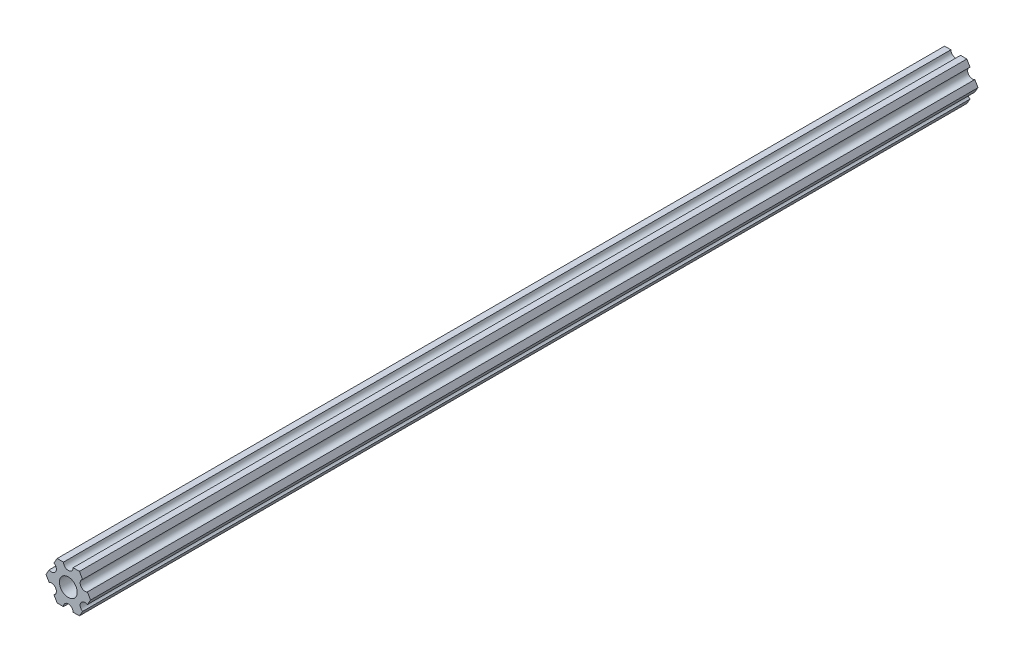
ISO-10303-21;
HEADER;
FILE_DESCRIPTION(('STEP AP214'),'2;1');
FILE_NAME('part.step','',(''),(''),'','','');
FILE_SCHEMA(('AUTOMOTIVE_DESIGN { 1 0 10303 214 1 1 1 1 }'));
ENDSEC;
DATA;
#1=APPLICATION_CONTEXT('core data for automotive mechanical design processes');
#2=APPLICATION_PROTOCOL_DEFINITION('international standard','automotive_design',2000,#1);
#3=PRODUCT_CONTEXT('',#1,'mechanical');
#4=PRODUCT('Part','Part','',(#3));
#5=PRODUCT_RELATED_PRODUCT_CATEGORY('part','',(#4));
#6=PRODUCT_DEFINITION_FORMATION('','',#4);
#7=PRODUCT_DEFINITION_CONTEXT('part definition',#1,'design');
#8=PRODUCT_DEFINITION('design','',#6,#7);
#9=PRODUCT_DEFINITION_SHAPE('','',#8);
#10=(LENGTH_UNIT() NAMED_UNIT(*) SI_UNIT(.MILLI.,.METRE.));
#11=(NAMED_UNIT(*) PLANE_ANGLE_UNIT() SI_UNIT($,.RADIAN.));
#12=(NAMED_UNIT(*) SI_UNIT($,.STERADIAN.) SOLID_ANGLE_UNIT());
#13=UNCERTAINTY_MEASURE_WITH_UNIT(LENGTH_MEASURE(1.E-05),#10,'distance_accuracy_value','');
#14=(GEOMETRIC_REPRESENTATION_CONTEXT(3) GLOBAL_UNCERTAINTY_ASSIGNED_CONTEXT((#13)) GLOBAL_UNIT_ASSIGNED_CONTEXT((#10,
#11,#12)) REPRESENTATION_CONTEXT('',''));
#15=CARTESIAN_POINT('',(0.,0.,0.));
#16=DIRECTION('',(0.,0.,1.));
#17=DIRECTION('',(1.,0.,0.));
#18=AXIS2_PLACEMENT_3D('',#15,#16,#17);
#19=CARTESIAN_POINT('',(6.29301142309098,-1.80018429024546,85.725));
#20=DIRECTION('',(-0.866025434075723,0.499999947533953,0.));
#21=DIRECTION('',(0.,0.,1.));
#22=AXIS2_PLACEMENT_3D('',#19,#20,#21);
#23=PLANE('',#22);
#24=DIRECTION('',(0.,0.,1.));
#25=VECTOR('',#24,1.);
#26=CARTESIAN_POINT('',(7.33234841870827,4.44212519169686E-07,85.725));
#27=LINE('',#26,#25);
#28=CARTESIAN_POINT('',(7.33234841870826,4.44212518961143E-07,-206.375));
#29=VERTEX_POINT('',#28);
#30=CARTESIAN_POINT('',(7.33234841870826,4.44212519315656E-07,85.725));
#31=VERTEX_POINT('',#30);
#32=EDGE_CURVE('E11',#29,#31,#27,.T.);
#33=ORIENTED_EDGE('',*,*,#32,.T.);
#34=DIRECTION('',(0.499999947533953,0.866025434075723,0.));
#35=VECTOR('',#34,1.);
#36=CARTESIAN_POINT('',(6.29301142309098,-1.80018429024546,85.725));
#37=LINE('',#36,#35);
#38=CARTESIAN_POINT('',(6.29301142309098,-1.80018429024546,85.725));
#39=VERTEX_POINT('',#38);
#40=EDGE_CURVE('E301',#39,#31,#37,.T.);
#41=ORIENTED_EDGE('',*,*,#40,.F.);
#42=DIRECTION('',(0.,0.,-1.));
#43=VECTOR('',#42,1.);
#44=CARTESIAN_POINT('',(6.29301142309098,-1.80018429024546,85.725));
#45=LINE('',#44,#43);
#46=CARTESIAN_POINT('',(6.29301142309098,-1.80018429024546,-206.375));
#47=VERTEX_POINT('',#46);
#48=EDGE_CURVE('E300',#39,#47,#45,.T.);
#49=ORIENTED_EDGE('',*,*,#48,.T.);
#50=DIRECTION('',(-0.499999947533953,-0.866025434075723,0.));
#51=VECTOR('',#50,1.);
#52=CARTESIAN_POINT('',(6.29301142309098,-1.80018429024546,-206.375));
#53=LINE('',#52,#51);
#54=EDGE_CURVE('E219',#29,#47,#53,.T.);
#55=ORIENTED_EDGE('',*,*,#54,.F.);
#56=EDGE_LOOP('',(#33,#41,#49,#55));
#57=FACE_BOUND('',#56,.T.);
#58=ADVANCED_FACE('F51',(#57),#23,.F.);
#59=CARTESIAN_POINT('',(7.33234841870827,4.44212519169686E-07,85.725));
#60=DIRECTION('',(-0.866025373493145,-0.500000052466057,0.));
#61=DIRECTION('',(-0.500000052466057,0.866025373493145,0.));
#62=AXIS2_PLACEMENT_3D('',#59,#60,#61);
#63=PLANE('',#62);
#64=DIRECTION('',(0.,0.,1.));
#65=VECTOR('',#64,1.);
#66=CARTESIAN_POINT('',(6.29301120497139,1.80018505273894,85.725));
#67=LINE('',#66,#65);
#68=CARTESIAN_POINT('',(6.29301120497139,1.80018505273894,-206.375));
#69=VERTEX_POINT('',#68);
#70=CARTESIAN_POINT('',(6.29301120497139,1.80018505273894,85.725));
#71=VERTEX_POINT('',#70);
#72=EDGE_CURVE('E59',#69,#71,#67,.T.);
#73=ORIENTED_EDGE('',*,*,#72,.T.);
#74=DIRECTION('',(-0.500000052466057,0.866025373493145,0.));
#75=VECTOR('',#74,1.);
#76=CARTESIAN_POINT('',(7.33234841870827,4.44212519198906E-07,85.725));
#77=LINE('',#76,#75);
#78=EDGE_CURVE('E305',#31,#71,#77,.T.);
#79=ORIENTED_EDGE('',*,*,#78,.F.);
#80=ORIENTED_EDGE('',*,*,#32,.F.);
#81=DIRECTION('',(0.500000052466055,-0.866025373493145,0.));
#82=VECTOR('',#81,1.);
#83=CARTESIAN_POINT('',(7.33234841870826,4.44212518961143E-07,-206.375));
#84=LINE('',#83,#82);
#85=EDGE_CURVE('E213',#69,#29,#84,.T.);
#86=ORIENTED_EDGE('',*,*,#85,.F.);
#87=EDGE_LOOP('',(#73,#79,#80,#86));
#88=FACE_BOUND('',#87,.T.);
#89=ADVANCED_FACE('F214',(#88),#63,.F.);
#90=CARTESIAN_POINT('',(4.70551103839172,4.54981561357972,85.725));
#91=DIRECTION('',(-0.866025373493151,-0.500000052466046,0.));
#92=DIRECTION('',(-0.500000052466046,0.866025373493151,0.));
#93=AXIS2_PLACEMENT_3D('',#90,#91,#92);
#94=PLANE('',#93);
#95=DIRECTION('',(0.,0.,1.));
#96=VECTOR('',#95,1.);
#97=CARTESIAN_POINT('',(3.66617382465481,6.35000022210627,85.725));
#98=LINE('',#97,#96);
#99=CARTESIAN_POINT('',(3.66617382465481,6.35000022210627,-206.375));
#100=VERTEX_POINT('',#99);
#101=CARTESIAN_POINT('',(3.66617382465481,6.35000022210627,85.725));
#102=VERTEX_POINT('',#101);
#103=EDGE_CURVE('E211',#100,#102,#98,.T.);
#104=ORIENTED_EDGE('',*,*,#103,.T.);
#105=DIRECTION('',(-0.500000052466046,0.866025373493151,0.));
#106=VECTOR('',#105,1.);
#107=CARTESIAN_POINT('',(4.70551103839172,4.54981561357972,85.725));
#108=LINE('',#107,#106);
#109=CARTESIAN_POINT('',(4.70551103839172,4.54981561357972,85.725));
#110=VERTEX_POINT('',#109);
#111=EDGE_CURVE('E336',#110,#102,#108,.T.);
#112=ORIENTED_EDGE('',*,*,#111,.F.);
#113=DIRECTION('',(0.,0.,1.));
#114=VECTOR('',#113,1.);
#115=CARTESIAN_POINT('',(4.70551103839172,4.54981561357972,85.725));
#116=LINE('',#115,#114);
#117=CARTESIAN_POINT('',(4.70551103839172,4.54981561357972,-206.375));
#118=VERTEX_POINT('',#117);
#119=EDGE_CURVE('E299',#118,#110,#116,.T.);
#120=ORIENTED_EDGE('',*,*,#119,.F.);
#121=DIRECTION('',(0.500000052466045,-0.866025373493151,0.));
#122=VECTOR('',#121,1.);
#123=CARTESIAN_POINT('',(4.70551103839172,4.54981561357972,-206.375));
#124=LINE('',#123,#122);
#125=EDGE_CURVE('E225',#100,#118,#124,.T.);
#126=ORIENTED_EDGE('',*,*,#125,.F.);
#127=EDGE_LOOP('',(#104,#112,#120,#126));
#128=FACE_BOUND('',#127,.T.);
#129=ADVANCED_FACE('F412',(#128),#94,.F.);
#130=CARTESIAN_POINT('',(3.66617382465481,6.35000022210627,85.725));
#131=DIRECTION('',(6.05825850611185E-08,-1.,0.));
#132=DIRECTION('',(0.,0.,-1.));
#133=AXIS2_PLACEMENT_3D('',#130,#131,#132);
#134=PLANE('',#133);
#135=DIRECTION('',(0.,0.,1.));
#136=VECTOR('',#135,1.);
#137=CARTESIAN_POINT('',(1.58749961530074,6.35000009617482,85.725));
#138=LINE('',#137,#136);
#139=CARTESIAN_POINT('',(1.58749961530073,6.35000015914054,-206.375));
#140=VERTEX_POINT('',#139);
#141=CARTESIAN_POINT('',(1.58749961530073,6.35000015914054,85.725));
#142=VERTEX_POINT('',#141);
#143=EDGE_CURVE('E333',#140,#142,#138,.T.);
#144=ORIENTED_EDGE('',*,*,#143,.T.);
#145=DIRECTION('',(-1.,0.,0.));
#146=VECTOR('',#145,1.);
#147=CARTESIAN_POINT('',(5.49926112168156,6.35000022210627,85.725));
#148=LINE('',#147,#146);
#149=EDGE_CURVE('E340',#102,#142,#148,.T.);
#150=ORIENTED_EDGE('',*,*,#149,.F.);
#151=ORIENTED_EDGE('',*,*,#103,.F.);
#152=DIRECTION('',(1.,3.02912931564594E-08,0.));
#153=VECTOR('',#152,1.);
#154=CARTESIAN_POINT('',(3.66617382465481,6.35000022210627,-206.375));
#155=LINE('',#154,#153);
#156=EDGE_CURVE('E287',#140,#100,#155,.T.);
#157=ORIENTED_EDGE('',*,*,#156,.F.);
#158=EDGE_LOOP('',(#144,#150,#151,#157));
#159=FACE_BOUND('',#158,.T.);
#160=ADVANCED_FACE('F415',(#159),#134,.F.);
#161=CARTESIAN_POINT('',(-3.84699260060323E-07,6.35,85.725));
#162=DIRECTION('',(0.,0.,-1.));
#163=DIRECTION('',(-1.,0.,0.));
#164=AXIS2_PLACEMENT_3D('',#161,#162,#163);
#165=CYLINDRICAL_SURFACE('',#164,1.5875);
#166=DIRECTION('',(0.,0.,1.));
#167=VECTOR('',#166,1.);
#168=CARTESIAN_POINT('',(-1.58750038469926,6.34999990382518,85.725));
#169=LINE('',#168,#167);
#170=CARTESIAN_POINT('',(-1.58750038469926,6.34999990382519,-206.375));
#171=VERTEX_POINT('',#170);
#172=CARTESIAN_POINT('',(-1.58750038469926,6.34999990382519,85.725));
#173=VERTEX_POINT('',#172);
#174=EDGE_CURVE('E330',#171,#173,#169,.T.);
#175=ORIENTED_EDGE('',*,*,#174,.T.);
#176=CARTESIAN_POINT('',(-3.84699260060323E-07,6.35,85.725));
#177=DIRECTION('',(0.,0.,-1.));
#178=DIRECTION('',(-1.,0.,0.));
#179=AXIS2_PLACEMENT_3D('',#176,#177,#178);
#180=CIRCLE('',#179,1.5875);
#181=EDGE_CURVE('E344',#142,#173,#180,.T.);
#182=ORIENTED_EDGE('',*,*,#181,.F.);
#183=ORIENTED_EDGE('',*,*,#143,.F.);
#184=CARTESIAN_POINT('',(-3.84699260060323E-07,6.35,-206.375));
#185=DIRECTION('',(0.,0.,1.));
#186=DIRECTION('',(-1.,0.,0.));
#187=AXIS2_PLACEMENT_3D('',#184,#185,#186);
#188=CIRCLE('',#187,1.5875);
#189=EDGE_CURVE('E283',#171,#140,#188,.T.);
#190=ORIENTED_EDGE('',*,*,#189,.F.);
#191=EDGE_LOOP('',(#175,#182,#183,#190));
#192=FACE_BOUND('',#191,.T.);
#193=ADVANCED_FACE('F464',(#192),#165,.F.);
#194=CARTESIAN_POINT('',(-1.58750038469926,6.34999990382518,85.725));
#195=DIRECTION('',(6.05825963273174E-08,-1.,0.));
#196=DIRECTION('',(0.,0.,-1.));
#197=AXIS2_PLACEMENT_3D('',#194,#195,#196);
#198=PLANE('',#197);
#199=DIRECTION('',(0.,0.,1.));
#200=VECTOR('',#199,1.);
#201=CARTESIAN_POINT('',(-3.66617459405349,6.3499997778937,85.725));
#202=LINE('',#201,#200);
#203=CARTESIAN_POINT('',(-3.66617454558244,6.34999986184803,-206.375));
#204=VERTEX_POINT('',#203);
#205=CARTESIAN_POINT('',(-3.66617454558244,6.34999986184803,85.725));
#206=VERTEX_POINT('',#205);
#207=EDGE_CURVE('E323',#204,#206,#202,.T.);
#208=ORIENTED_EDGE('',*,*,#207,.T.);
#209=DIRECTION('',(-1.,0.,0.));
#210=VECTOR('',#209,1.);
#211=CARTESIAN_POINT('',(5.49926112168156,6.34999990382519,85.725));
#212=LINE('',#211,#210);
#213=EDGE_CURVE('E348',#173,#206,#212,.T.);
#214=ORIENTED_EDGE('',*,*,#213,.F.);
#215=ORIENTED_EDGE('',*,*,#174,.F.);
#216=DIRECTION('',(1.,2.0194198968488E-08,0.));
#217=VECTOR('',#216,1.);
#218=CARTESIAN_POINT('',(-1.58750038469926,6.34999990382519,-206.375));
#219=LINE('',#218,#217);
#220=EDGE_CURVE('E279',#204,#171,#219,.T.);
#221=ORIENTED_EDGE('',*,*,#220,.F.);
#222=EDGE_LOOP('',(#208,#214,#215,#221));
#223=FACE_BOUND('',#222,.T.);
#224=ADVANCED_FACE('F461',(#223),#198,.F.);
#225=CARTESIAN_POINT('',(-3.66617459405349,6.3499997778937,85.725));
#226=DIRECTION('',(0.866025434075729,-0.499999947533942,0.));
#227=DIRECTION('',(0.,0.,-1.));
#228=AXIS2_PLACEMENT_3D('',#225,#226,#227);
#229=PLANE('',#228);
#230=DIRECTION('',(0.,0.,1.));
#231=VECTOR('',#230,1.);
#232=CARTESIAN_POINT('',(-4.70551158967065,4.54981504343587,85.725));
#233=LINE('',#232,#231);
#234=CARTESIAN_POINT('',(-4.70551158967065,4.54981504343587,-206.375));
#235=VERTEX_POINT('',#234);
#236=CARTESIAN_POINT('',(-4.70551158967065,4.54981504343587,85.725));
#237=VERTEX_POINT('',#236);
#238=EDGE_CURVE('E320',#235,#237,#233,.T.);
#239=ORIENTED_EDGE('',*,*,#238,.T.);
#240=DIRECTION('',(-0.499999947533943,-0.866025434075729,0.));
#241=VECTOR('',#240,1.);
#242=CARTESIAN_POINT('',(-3.66617459405349,6.3499997778937,85.725));
#243=LINE('',#242,#241);
#244=EDGE_CURVE('E352',#206,#237,#243,.T.);
#245=ORIENTED_EDGE('',*,*,#244,.F.);
#246=ORIENTED_EDGE('',*,*,#207,.F.);
#247=DIRECTION('',(0.499999947533939,0.866025434075731,0.));
#248=VECTOR('',#247,1.);
#249=CARTESIAN_POINT('',(-3.66617454558244,6.34999986184803,-206.375));
#250=LINE('',#249,#248);
#251=EDGE_CURVE('E275',#235,#204,#250,.T.);
#252=ORIENTED_EDGE('',*,*,#251,.F.);
#253=EDGE_LOOP('',(#239,#245,#246,#252));
#254=FACE_BOUND('',#253,.T.);
#255=ADVANCED_FACE('F457',(#254),#229,.F.);
#256=CARTESIAN_POINT('',(-5.49926150638082,3.17499966684067,85.725));
#257=DIRECTION('',(0.,0.,-1.));
#258=DIRECTION('',(-1.,0.,0.));
#259=AXIS2_PLACEMENT_3D('',#256,#257,#258);
#260=CYLINDRICAL_SURFACE('',#259,1.5875);
#261=DIRECTION('',(0.,0.,1.));
#262=VECTOR('',#261,1.);
#263=CARTESIAN_POINT('',(-6.29301142309098,1.80018429024547,85.725));
#264=LINE('',#263,#262);
#265=CARTESIAN_POINT('',(-6.29301142309098,1.80018429024546,-206.375));
#266=VERTEX_POINT('',#265);
#267=CARTESIAN_POINT('',(-6.29301142309098,1.80018429024547,85.725));
#268=VERTEX_POINT('',#267);
#269=EDGE_CURVE('E324',#266,#268,#264,.T.);
#270=ORIENTED_EDGE('',*,*,#269,.T.);
#271=CARTESIAN_POINT('',(-5.49926150638082,3.17499966684067,85.725));
#272=DIRECTION('',(0.,0.,-1.));
#273=DIRECTION('',(-1.,0.,0.));
#274=AXIS2_PLACEMENT_3D('',#271,#272,#273);
#275=CIRCLE('',#274,1.5875);
#276=EDGE_CURVE('E362',#237,#268,#275,.T.);
#277=ORIENTED_EDGE('',*,*,#276,.F.);
#278=ORIENTED_EDGE('',*,*,#238,.F.);
#279=CARTESIAN_POINT('',(-5.49926150638082,3.17499966684067,-206.375));
#280=DIRECTION('',(0.,0.,1.));
#281=DIRECTION('',(-1.,0.,0.));
#282=AXIS2_PLACEMENT_3D('',#279,#280,#281);
#283=CIRCLE('',#282,1.5875);
#284=EDGE_CURVE('E271',#266,#235,#283,.T.);
#285=ORIENTED_EDGE('',*,*,#284,.F.);
#286=EDGE_LOOP('',(#270,#277,#278,#285));
#287=FACE_BOUND('',#286,.T.);
#288=ADVANCED_FACE('F453',(#287),#260,.F.);
#289=CARTESIAN_POINT('',(-6.29301142309098,1.80018429024547,85.725));
#290=DIRECTION('',(0.866025434075724,-0.499999947533952,0.));
#291=DIRECTION('',(0.,0.,-1.));
#292=AXIS2_PLACEMENT_3D('',#289,#290,#291);
#293=PLANE('',#292);
#294=DIRECTION('',(0.,0.,1.));
#295=VECTOR('',#294,1.);
#296=CARTESIAN_POINT('',(-7.33234841870827,-4.44212523790841E-07,85.725));
#297=LINE('',#296,#295);
#298=CARTESIAN_POINT('',(-7.33234841870826,-4.44212524036367E-07,-206.375));
#299=VERTEX_POINT('',#298);
#300=CARTESIAN_POINT('',(-7.33234841870826,-4.44212524036367E-07,85.725));
#301=VERTEX_POINT('',#300);
#302=EDGE_CURVE('E317',#299,#301,#297,.T.);
#303=ORIENTED_EDGE('',*,*,#302,.T.);
#304=DIRECTION('',(-0.499999947533952,-0.866025434075724,0.));
#305=VECTOR('',#304,1.);
#306=CARTESIAN_POINT('',(-6.29301142309098,1.80018429024547,85.725));
#307=LINE('',#306,#305);
#308=EDGE_CURVE('E358',#268,#301,#307,.T.);
#309=ORIENTED_EDGE('',*,*,#308,.F.);
#310=ORIENTED_EDGE('',*,*,#269,.F.);
#311=DIRECTION('',(0.499999947533951,0.866025434075724,0.));
#312=VECTOR('',#311,1.);
#313=CARTESIAN_POINT('',(-6.29301142309098,1.80018429024547,-206.375));
#314=LINE('',#313,#312);
#315=EDGE_CURVE('E267',#299,#266,#314,.T.);
#316=ORIENTED_EDGE('',*,*,#315,.F.);
#317=EDGE_LOOP('',(#303,#309,#310,#316));
#318=FACE_BOUND('',#317,.T.);
#319=ADVANCED_FACE('F449',(#318),#293,.F.);
#320=CARTESIAN_POINT('',(-7.33234841870827,-4.44212523790841E-07,85.725));
#321=DIRECTION('',(0.866025373493151,0.500000052466045,0.));
#322=DIRECTION('',(0.,0.,-1.));
#323=AXIS2_PLACEMENT_3D('',#320,#321,#322);
#324=PLANE('',#323);
#325=DIRECTION('',(0.,0.,1.));
#326=VECTOR('',#325,1.);
#327=CARTESIAN_POINT('',(-6.29301120497141,-1.80018505273897,85.725));
#328=LINE('',#327,#326);
#329=CARTESIAN_POINT('',(-6.29301120497141,-1.80018505273897,-206.375));
#330=VERTEX_POINT('',#329);
#331=CARTESIAN_POINT('',(-6.29301120497141,-1.80018505273897,85.725));
#332=VERTEX_POINT('',#331);
#333=EDGE_CURVE('E310',#330,#332,#328,.T.);
#334=ORIENTED_EDGE('',*,*,#333,.T.);
#335=DIRECTION('',(0.500000052466045,-0.866025373493151,0.));
#336=VECTOR('',#335,1.);
#337=CARTESIAN_POINT('',(-7.33234841870827,-4.44212523969395E-07,85.725));
#338=LINE('',#337,#336);
#339=EDGE_CURVE('E353',#301,#332,#338,.T.);
#340=ORIENTED_EDGE('',*,*,#339,.F.);
#341=ORIENTED_EDGE('',*,*,#302,.F.);
#342=DIRECTION('',(-0.500000052466045,0.866025373493152,0.));
#343=VECTOR('',#342,1.);
#344=CARTESIAN_POINT('',(-7.33234841870826,-4.44212524036367E-07,-206.375));
#345=LINE('',#344,#343);
#346=EDGE_CURVE('E263',#330,#299,#345,.T.);
#347=ORIENTED_EDGE('',*,*,#346,.F.);
#348=EDGE_LOOP('',(#334,#340,#341,#347));
#349=FACE_BOUND('',#348,.T.);
#350=ADVANCED_FACE('F445',(#349),#324,.F.);
#351=CARTESIAN_POINT('',(-5.49926112168156,-3.17500033315934,85.725));
#352=DIRECTION('',(0.,0.,-1.));
#353=DIRECTION('',(-1.,0.,0.));
#354=AXIS2_PLACEMENT_3D('',#351,#352,#353);
#355=CYLINDRICAL_SURFACE('',#354,1.5875);
#356=DIRECTION('',(0.,0.,1.));
#357=VECTOR('',#356,1.);
#358=CARTESIAN_POINT('',(-4.70551103839172,-4.54981561357972,85.725));
#359=LINE('',#358,#357);
#360=CARTESIAN_POINT('',(-4.70551103839172,-4.54981561357972,-206.375));
#361=VERTEX_POINT('',#360);
#362=CARTESIAN_POINT('',(-4.70551103839172,-4.54981561357972,85.725));
#363=VERTEX_POINT('',#362);
#364=EDGE_CURVE('E307',#361,#363,#359,.T.);
#365=ORIENTED_EDGE('',*,*,#364,.T.);
#366=CARTESIAN_POINT('',(-5.49926112168156,-3.17500033315934,85.725));
#367=DIRECTION('',(0.,0.,-1.));
#368=DIRECTION('',(-1.,0.,0.));
#369=AXIS2_PLACEMENT_3D('',#366,#367,#368);
#370=CIRCLE('',#369,1.5875);
#371=EDGE_CURVE('E357',#332,#363,#370,.T.);
#372=ORIENTED_EDGE('',*,*,#371,.F.);
#373=ORIENTED_EDGE('',*,*,#333,.F.);
#374=CARTESIAN_POINT('',(-5.49926112168156,-3.17500033315934,-206.375));
#375=DIRECTION('',(0.,0.,1.));
#376=DIRECTION('',(-1.,0.,0.));
#377=AXIS2_PLACEMENT_3D('',#374,#375,#376);
#378=CIRCLE('',#377,1.5875);
#379=EDGE_CURVE('E259',#361,#330,#378,.T.);
#380=ORIENTED_EDGE('',*,*,#379,.F.);
#381=EDGE_LOOP('',(#365,#372,#373,#380));
#382=FACE_BOUND('',#381,.T.);
#383=ADVANCED_FACE('F441',(#382),#355,.F.);
#384=CARTESIAN_POINT('',(-4.70551103839172,-4.54981561357972,85.725));
#385=DIRECTION('',(0.866025373493152,0.500000052466045,0.));
#386=DIRECTION('',(0.,0.,-1.));
#387=AXIS2_PLACEMENT_3D('',#384,#385,#386);
#388=PLANE('',#387);
#389=DIRECTION('',(0.,0.,1.));
#390=VECTOR('',#389,1.);
#391=CARTESIAN_POINT('',(-3.66617382465481,-6.35000022210628,85.725));
#392=LINE('',#391,#390);
#393=CARTESIAN_POINT('',(-3.66617382465481,-6.35000022210628,-206.375));
#394=VERTEX_POINT('',#393);
#395=CARTESIAN_POINT('',(-3.66617382465481,-6.35000022210628,85.725));
#396=VERTEX_POINT('',#395);
#397=EDGE_CURVE('E311',#394,#396,#392,.T.);
#398=ORIENTED_EDGE('',*,*,#397,.T.);
#399=DIRECTION('',(0.500000052466045,-0.866025373493151,0.));
#400=VECTOR('',#399,1.);
#401=CARTESIAN_POINT('',(-4.70551103839172,-4.54981561357972,85.725));
#402=LINE('',#401,#400);
#403=EDGE_CURVE('E372',#363,#396,#402,.T.);
#404=ORIENTED_EDGE('',*,*,#403,.F.);
#405=ORIENTED_EDGE('',*,*,#364,.F.);
#406=DIRECTION('',(-0.500000052466043,0.866025373493152,0.));
#407=VECTOR('',#406,1.);
#408=CARTESIAN_POINT('',(-4.70551103839172,-4.54981561357972,-206.375));
#409=LINE('',#408,#407);
#410=EDGE_CURVE('E255',#394,#361,#409,.T.);
#411=ORIENTED_EDGE('',*,*,#410,.F.);
#412=EDGE_LOOP('',(#398,#404,#405,#411));
#413=FACE_BOUND('',#412,.T.);
#414=ADVANCED_FACE('F437',(#413),#388,.F.);
#415=CARTESIAN_POINT('',(-3.66617382465481,-6.35000022210628,85.725));
#416=DIRECTION('',(-6.05825854783851E-08,1.,0.));
#417=DIRECTION('',(0.,0.,1.));
#418=AXIS2_PLACEMENT_3D('',#415,#416,#417);
#419=PLANE('',#418);
#420=DIRECTION('',(0.,0.,1.));
#421=VECTOR('',#420,1.);
#422=CARTESIAN_POINT('',(-1.58749961530074,-6.35,85.725));
#423=LINE('',#422,#421);
#424=CARTESIAN_POINT('',(-1.58749961530073,-6.35000011105314,-206.375));
#425=VERTEX_POINT('',#424);
#426=CARTESIAN_POINT('',(-1.58749961530073,-6.35000011105314,85.725));
#427=VERTEX_POINT('',#426);
#428=EDGE_CURVE('E82',#425,#427,#423,.T.);
#429=ORIENTED_EDGE('',*,*,#428,.T.);
#430=DIRECTION('',(1.,0.,0.));
#431=VECTOR('',#430,1.);
#432=CARTESIAN_POINT('',(5.49926112168156,-6.35000022210628,85.725));
#433=LINE('',#432,#431);
#434=EDGE_CURVE('E376',#396,#427,#433,.T.);
#435=ORIENTED_EDGE('',*,*,#434,.F.);
#436=ORIENTED_EDGE('',*,*,#397,.F.);
#437=DIRECTION('',(-0.999999999999999,-5.34249856349036E-08,0.));
#438=VECTOR('',#437,1.);
#439=CARTESIAN_POINT('',(-3.66617382465481,-6.35000022210628,-206.375));
#440=LINE('',#439,#438);
#441=EDGE_CURVE('E251',#425,#394,#440,.T.);
#442=ORIENTED_EDGE('',*,*,#441,.F.);
#443=EDGE_LOOP('',(#429,#435,#436,#442));
#444=FACE_BOUND('',#443,.T.);
#445=ADVANCED_FACE('F434',(#444),#419,.F.);
#446=CARTESIAN_POINT('',(3.8469926204343E-07,-6.35,85.725));
#447=DIRECTION('',(0.,0.,-1.));
#448=DIRECTION('',(-1.,0.,0.));
#449=AXIS2_PLACEMENT_3D('',#446,#447,#448);
#450=CYLINDRICAL_SURFACE('',#449,1.5875);
#451=DIRECTION('',(0.,0.,1.));
#452=VECTOR('',#451,1.);
#453=CARTESIAN_POINT('',(1.58750038469926,-6.34999990382518,85.725));
#454=LINE('',#453,#452);
#455=CARTESIAN_POINT('',(1.58750038469926,-6.34999990382519,-206.375));
#456=VERTEX_POINT('',#455);
#457=CARTESIAN_POINT('',(1.58750038469926,-6.34999990382519,85.725));
#458=VERTEX_POINT('',#457);
#459=EDGE_CURVE('E71',#456,#458,#454,.T.);
#460=ORIENTED_EDGE('',*,*,#459,.T.);
#461=CARTESIAN_POINT('',(3.8469926204343E-07,-6.35,85.725));
#462=DIRECTION('',(0.,0.,-1.));
#463=DIRECTION('',(-1.,0.,0.));
#464=AXIS2_PLACEMENT_3D('',#461,#462,#463);
#465=CIRCLE('',#464,1.5875);
#466=EDGE_CURVE('E380',#427,#458,#465,.T.);
#467=ORIENTED_EDGE('',*,*,#466,.F.);
#468=ORIENTED_EDGE('',*,*,#428,.F.);
#469=CARTESIAN_POINT('',(3.8469926204343E-07,-6.35,-206.375));
#470=DIRECTION('',(0.,0.,1.));
#471=DIRECTION('',(-1.,0.,0.));
#472=AXIS2_PLACEMENT_3D('',#469,#470,#471);
#473=CIRCLE('',#472,1.5875);
#474=EDGE_CURVE('E247',#456,#425,#473,.T.);
#475=ORIENTED_EDGE('',*,*,#474,.F.);
#476=EDGE_LOOP('',(#460,#467,#468,#475));
#477=FACE_BOUND('',#476,.T.);
#478=ADVANCED_FACE('F432',(#477),#450,.F.);
#479=CARTESIAN_POINT('',(1.58750038469926,-6.34999990382518,85.725));
#480=DIRECTION('',(-6.05825721258438E-08,1.,0.));
#481=DIRECTION('',(0.,0.,1.));
#482=AXIS2_PLACEMENT_3D('',#479,#480,#481);
#483=PLANE('',#482);
#484=DIRECTION('',(0.,0.,1.));
#485=VECTOR('',#484,1.);
#486=CARTESIAN_POINT('',(3.66617459405346,-6.34999977789375,85.725));
#487=LINE('',#486,#485);
#488=CARTESIAN_POINT('',(3.66617454558244,-6.34999986184804,-206.375));
#489=VERTEX_POINT('',#488);
#490=CARTESIAN_POINT('',(3.66617454558244,-6.34999986184804,85.725));
#491=VERTEX_POINT('',#490);
#492=EDGE_CURVE('E381',#489,#491,#487,.T.);
#493=ORIENTED_EDGE('',*,*,#492,.T.);
#494=DIRECTION('',(1.,0.,0.));
#495=VECTOR('',#494,1.);
#496=CARTESIAN_POINT('',(5.49926112168156,-6.34999990382519,85.725));
#497=LINE('',#496,#495);
#498=EDGE_CURVE('E388',#458,#491,#497,.T.);
#499=ORIENTED_EDGE('',*,*,#498,.F.);
#500=ORIENTED_EDGE('',*,*,#459,.F.);
#501=DIRECTION('',(-1.,-2.01941943785532E-08,0.));
#502=VECTOR('',#501,1.);
#503=CARTESIAN_POINT('',(1.58750038469926,-6.34999990382519,-206.375));
#504=LINE('',#503,#502);
#505=EDGE_CURVE('E243',#489,#456,#504,.T.);
#506=ORIENTED_EDGE('',*,*,#505,.F.);
#507=EDGE_LOOP('',(#493,#499,#500,#506));
#508=FACE_BOUND('',#507,.T.);
#509=ADVANCED_FACE('F431',(#508),#483,.F.);
#510=CARTESIAN_POINT('',(3.66617459405346,-6.34999977789375,85.725));
#511=DIRECTION('',(-0.86602543407573,0.499999947533941,0.));
#512=DIRECTION('',(0.,0.,1.));
#513=AXIS2_PLACEMENT_3D('',#510,#511,#512);
#514=PLANE('',#513);
#515=DIRECTION('',(0.,0.,-1.));
#516=VECTOR('',#515,1.);
#517=CARTESIAN_POINT('',(4.70551158967065,-4.54981504343587,85.725));
#518=LINE('',#517,#516);
#519=CARTESIAN_POINT('',(4.70551158967065,-4.54981504343587,85.725));
#520=VERTEX_POINT('',#519);
#521=CARTESIAN_POINT('',(4.70551158967065,-4.54981504343587,-206.375));
#522=VERTEX_POINT('',#521);
#523=EDGE_CURVE('E384',#520,#522,#518,.T.);
#524=ORIENTED_EDGE('',*,*,#523,.F.);
#525=DIRECTION('',(0.49999994753394,0.86602543407573,0.));
#526=VECTOR('',#525,1.);
#527=CARTESIAN_POINT('',(3.66617459405346,-6.34999977789376,85.725));
#528=LINE('',#527,#526);
#529=EDGE_CURVE('E306',#491,#520,#528,.T.);
#530=ORIENTED_EDGE('',*,*,#529,.F.);
#531=ORIENTED_EDGE('',*,*,#492,.F.);
#532=DIRECTION('',(-0.499999947533941,-0.86602543407573,0.));
#533=VECTOR('',#532,1.);
#534=CARTESIAN_POINT('',(3.66617454558244,-6.34999986184804,-206.375));
#535=LINE('',#534,#533);
#536=EDGE_CURVE('E239',#522,#489,#535,.T.);
#537=ORIENTED_EDGE('',*,*,#536,.F.);
#538=EDGE_LOOP('',(#524,#530,#531,#537));
#539=FACE_BOUND('',#538,.T.);
#540=ADVANCED_FACE('F428',(#539),#514,.F.);
#541=CARTESIAN_POINT('',(5.49926112168156,3.17500033315934,85.725));
#542=DIRECTION('',(0.,0.,1.));
#543=DIRECTION('',(1.,0.,0.));
#544=AXIS2_PLACEMENT_3D('',#541,#542,#543);
#545=PLANE('',#544);
#546=CARTESIAN_POINT('',(0.,0.,85.725));
#547=DIRECTION('',(0.,0.,-1.));
#548=DIRECTION('',(-1.,0.,0.));
#549=AXIS2_PLACEMENT_3D('',#546,#547,#548);
#550=CIRCLE('',#549,2.9337);
#551=CARTESIAN_POINT('',(-2.9337,0.,85.725));
#552=VERTEX_POINT('',#551);
#553=EDGE_CURVE('E292',#552,#552,#550,.T.);
#554=ORIENTED_EDGE('',*,*,#553,.T.);
#555=EDGE_LOOP('',(#554));
#556=FACE_BOUND('',#555,.T.);
#557=ORIENTED_EDGE('',*,*,#529,.T.);
#558=CARTESIAN_POINT('',(5.49926150638082,-3.17499966684067,85.725));
#559=DIRECTION('',(0.,0.,-1.));
#560=DIRECTION('',(-1.,0.,0.));
#561=AXIS2_PLACEMENT_3D('',#558,#559,#560);
#562=CIRCLE('',#561,1.5875);
#563=EDGE_CURVE('E296',#520,#39,#562,.T.);
#564=ORIENTED_EDGE('',*,*,#563,.T.);
#565=ORIENTED_EDGE('',*,*,#40,.T.);
#566=ORIENTED_EDGE('',*,*,#78,.T.);
#567=CARTESIAN_POINT('',(5.49926112168156,3.17500033315934,85.725));
#568=DIRECTION('',(0.,0.,-1.));
#569=DIRECTION('',(-1.,0.,0.));
#570=AXIS2_PLACEMENT_3D('',#567,#568,#569);
#571=CIRCLE('',#570,1.5875);
#572=EDGE_CURVE('E206',#71,#110,#571,.T.);
#573=ORIENTED_EDGE('',*,*,#572,.T.);
#574=ORIENTED_EDGE('',*,*,#111,.T.);
#575=ORIENTED_EDGE('',*,*,#149,.T.);
#576=ORIENTED_EDGE('',*,*,#181,.T.);
#577=ORIENTED_EDGE('',*,*,#213,.T.);
#578=ORIENTED_EDGE('',*,*,#244,.T.);
#579=ORIENTED_EDGE('',*,*,#276,.T.);
#580=ORIENTED_EDGE('',*,*,#308,.T.);
#581=ORIENTED_EDGE('',*,*,#339,.T.);
#582=ORIENTED_EDGE('',*,*,#371,.T.);
#583=ORIENTED_EDGE('',*,*,#403,.T.);
#584=ORIENTED_EDGE('',*,*,#434,.T.);
#585=ORIENTED_EDGE('',*,*,#466,.T.);
#586=ORIENTED_EDGE('',*,*,#498,.T.);
#587=EDGE_LOOP('',(#557,#564,#565,#566,#573,#574,#575,#576,#577,#578,#579,#580,#581,#582,#583,
#584,#585,#586));
#588=FACE_BOUND('',#587,.T.);
#589=ADVANCED_FACE('F418',(#556,#588),#545,.T.);
#590=CARTESIAN_POINT('',(5.49926112168156,3.17500033315934,85.725));
#591=DIRECTION('',(0.,0.,-1.));
#592=DIRECTION('',(-1.,0.,0.));
#593=AXIS2_PLACEMENT_3D('',#590,#591,#592);
#594=CYLINDRICAL_SURFACE('',#593,1.5875);
#595=ORIENTED_EDGE('',*,*,#572,.F.);
#596=ORIENTED_EDGE('',*,*,#72,.F.);
#597=CARTESIAN_POINT('',(5.49926112168156,3.17500033315934,-206.375));
#598=DIRECTION('',(0.,0.,1.));
#599=DIRECTION('',(-1.,0.,0.));
#600=AXIS2_PLACEMENT_3D('',#597,#598,#599);
#601=CIRCLE('',#600,1.5875);
#602=EDGE_CURVE('E203',#118,#69,#601,.T.);
#603=ORIENTED_EDGE('',*,*,#602,.F.);
#604=ORIENTED_EDGE('',*,*,#119,.T.);
#605=EDGE_LOOP('',(#595,#596,#603,#604));
#606=FACE_BOUND('',#605,.T.);
#607=ADVANCED_FACE('F200',(#606),#594,.F.);
#608=CARTESIAN_POINT('',(5.49926150638082,-3.17499966684067,85.725));
#609=DIRECTION('',(0.,0.,-1.));
#610=DIRECTION('',(-1.,0.,0.));
#611=AXIS2_PLACEMENT_3D('',#608,#609,#610);
#612=CYLINDRICAL_SURFACE('',#611,1.5875);
#613=ORIENTED_EDGE('',*,*,#563,.F.);
#614=ORIENTED_EDGE('',*,*,#523,.T.);
#615=CARTESIAN_POINT('',(5.49926150638082,-3.17499966684067,-206.375));
#616=DIRECTION('',(0.,0.,1.));
#617=DIRECTION('',(-1.,0.,0.));
#618=AXIS2_PLACEMENT_3D('',#615,#616,#617);
#619=CIRCLE('',#618,1.5875);
#620=EDGE_CURVE('E235',#47,#522,#619,.T.);
#621=ORIENTED_EDGE('',*,*,#620,.F.);
#622=ORIENTED_EDGE('',*,*,#48,.F.);
#623=EDGE_LOOP('',(#613,#614,#621,#622));
#624=FACE_BOUND('',#623,.T.);
#625=ADVANCED_FACE('F423',(#624),#612,.F.);
#626=CARTESIAN_POINT('',(0.,0.,85.725));
#627=DIRECTION('',(0.,0.,-1.));
#628=DIRECTION('',(-1.,0.,0.));
#629=AXIS2_PLACEMENT_3D('',#626,#627,#628);
#630=CYLINDRICAL_SURFACE('',#629,2.9337);
#631=ORIENTED_EDGE('',*,*,#553,.F.);
#632=EDGE_LOOP('',(#631));
#633=FACE_BOUND('',#632,.T.);
#634=CARTESIAN_POINT('',(0.,0.,-206.375));
#635=DIRECTION('',(0.,0.,-1.));
#636=DIRECTION('',(-1.,0.,0.));
#637=AXIS2_PLACEMENT_3D('',#634,#635,#636);
#638=CIRCLE('',#637,2.9337);
#639=CARTESIAN_POINT('',(-2.9337,0.,-206.375));
#640=VERTEX_POINT('',#639);
#641=EDGE_CURVE('E227',#640,#640,#638,.T.);
#642=ORIENTED_EDGE('',*,*,#641,.T.);
#643=EDGE_LOOP('',(#642));
#644=FACE_BOUND('',#643,.T.);
#645=ADVANCED_FACE('F483',(#633,#644),#630,.F.);
#646=CARTESIAN_POINT('',(5.49926112168156,3.17500033315934,-206.375));
#647=DIRECTION('',(0.,0.,-1.));
#648=DIRECTION('',(-1.,0.,0.));
#649=AXIS2_PLACEMENT_3D('',#646,#647,#648);
#650=PLANE('',#649);
#651=ORIENTED_EDGE('',*,*,#602,.T.);
#652=ORIENTED_EDGE('',*,*,#85,.T.);
#653=ORIENTED_EDGE('',*,*,#54,.T.);
#654=ORIENTED_EDGE('',*,*,#620,.T.);
#655=ORIENTED_EDGE('',*,*,#536,.T.);
#656=ORIENTED_EDGE('',*,*,#505,.T.);
#657=ORIENTED_EDGE('',*,*,#474,.T.);
#658=ORIENTED_EDGE('',*,*,#441,.T.);
#659=ORIENTED_EDGE('',*,*,#410,.T.);
#660=ORIENTED_EDGE('',*,*,#379,.T.);
#661=ORIENTED_EDGE('',*,*,#346,.T.);
#662=ORIENTED_EDGE('',*,*,#315,.T.);
#663=ORIENTED_EDGE('',*,*,#284,.T.);
#664=ORIENTED_EDGE('',*,*,#251,.T.);
#665=ORIENTED_EDGE('',*,*,#220,.T.);
#666=ORIENTED_EDGE('',*,*,#189,.T.);
#667=ORIENTED_EDGE('',*,*,#156,.T.);
#668=ORIENTED_EDGE('',*,*,#125,.T.);
#669=EDGE_LOOP('',(#651,#652,#653,#654,#655,#656,#657,#658,#659,#660,#661,#662,#663,#664,#665,
#666,#667,#668));
#670=FACE_BOUND('',#669,.T.);
#671=ORIENTED_EDGE('',*,*,#641,.F.);
#672=EDGE_LOOP('',(#671));
#673=FACE_BOUND('',#672,.T.);
#674=ADVANCED_FACE('F221',(#670,#673),#650,.T.);
#675=CLOSED_SHELL('',(#58,#89,#129,#160,#193,#224,#255,#288,#319,#350,#383,#414,#445,#478,#509,
#540,#589,#607,#625,#645,#674));
#676=MANIFOLD_SOLID_BREP('B2',#675);
#677=ADVANCED_BREP_SHAPE_REPRESENTATION('',(#18,#676),#14);
#678=SHAPE_DEFINITION_REPRESENTATION(#9,#677);
ENDSEC;
END-ISO-10303-21;
